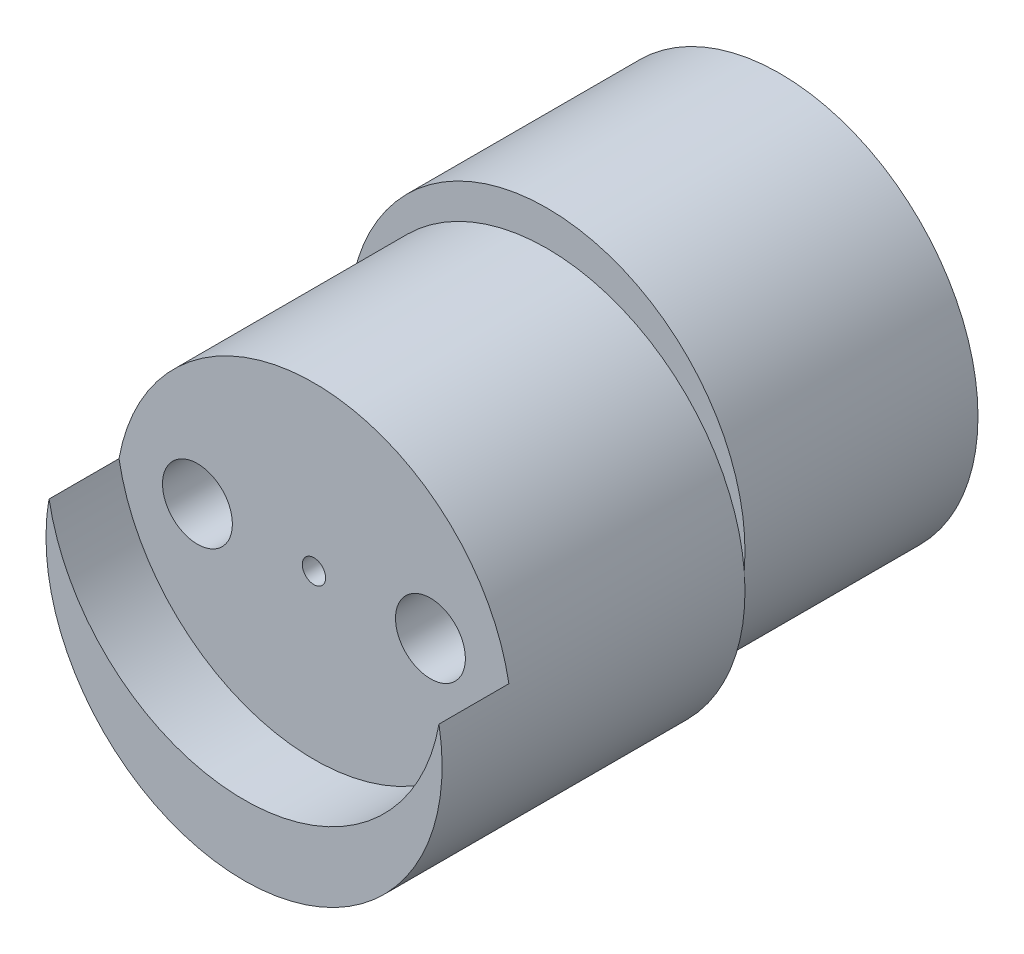
ISO-10303-21;
HEADER;
FILE_DESCRIPTION(('STEP AP214'),'2;1');
FILE_NAME('part.step','',(''),(''),'','','');
FILE_SCHEMA(('AUTOMOTIVE_DESIGN { 1 0 10303 214 1 1 1 1 }'));
ENDSEC;
DATA;
#1=APPLICATION_CONTEXT('core data for automotive mechanical design processes');
#2=APPLICATION_PROTOCOL_DEFINITION('international standard','automotive_design',2000,#1);
#3=PRODUCT_CONTEXT('',#1,'mechanical');
#4=PRODUCT('Part','Part','',(#3));
#5=PRODUCT_RELATED_PRODUCT_CATEGORY('part','',(#4));
#6=PRODUCT_DEFINITION_FORMATION('','',#4);
#7=PRODUCT_DEFINITION_CONTEXT('part definition',#1,'design');
#8=PRODUCT_DEFINITION('design','',#6,#7);
#9=PRODUCT_DEFINITION_SHAPE('','',#8);
#10=(LENGTH_UNIT() NAMED_UNIT(*) SI_UNIT(.MILLI.,.METRE.));
#11=(NAMED_UNIT(*) PLANE_ANGLE_UNIT() SI_UNIT($,.RADIAN.));
#12=(NAMED_UNIT(*) SI_UNIT($,.STERADIAN.) SOLID_ANGLE_UNIT());
#13=UNCERTAINTY_MEASURE_WITH_UNIT(LENGTH_MEASURE(1.E-05),#10,'distance_accuracy_value','');
#14=(GEOMETRIC_REPRESENTATION_CONTEXT(3) GLOBAL_UNCERTAINTY_ASSIGNED_CONTEXT((#13)) GLOBAL_UNIT_ASSIGNED_CONTEXT((#10,
#11,#12)) REPRESENTATION_CONTEXT('',''));
#15=CARTESIAN_POINT('',(0.,0.,0.));
#16=DIRECTION('',(0.,0.,1.));
#17=DIRECTION('',(1.,0.,0.));
#18=AXIS2_PLACEMENT_3D('',#15,#16,#17);
#19=CARTESIAN_POINT('',(0.,-1.5,20.));
#20=DIRECTION('',(0.,0.,1.));
#21=DIRECTION('',(1.,0.,0.));
#22=AXIS2_PLACEMENT_3D('',#19,#20,#21);
#23=PLANE('',#22);
#24=CARTESIAN_POINT('',(0.,0.,20.));
#25=DIRECTION('',(0.,0.,1.));
#26=DIRECTION('',(1.,0.,0.));
#27=AXIS2_PLACEMENT_3D('',#24,#25,#26);
#28=CIRCLE('',#27,0.5);
#29=CARTESIAN_POINT('',(0.5,0.,20.));
#30=VERTEX_POINT('',#29);
#31=EDGE_CURVE('E106',#30,#30,#28,.T.);
#32=ORIENTED_EDGE('',*,*,#31,.F.);
#33=EDGE_LOOP('',(#32));
#34=FACE_BOUND('',#33,.T.);
#35=CARTESIAN_POINT('',(-5.,0.,20.));
#36=DIRECTION('',(0.,0.,1.));
#37=DIRECTION('',(1.,0.,0.));
#38=AXIS2_PLACEMENT_3D('',#35,#36,#37);
#39=CIRCLE('',#38,1.5);
#40=CARTESIAN_POINT('',(-3.5,0.,20.));
#41=VERTEX_POINT('',#40);
#42=EDGE_CURVE('E104',#41,#41,#39,.T.);
#43=ORIENTED_EDGE('',*,*,#42,.F.);
#44=EDGE_LOOP('',(#43));
#45=FACE_BOUND('',#44,.T.);
#46=CARTESIAN_POINT('',(5.,0.,20.));
#47=DIRECTION('',(0.,0.,1.));
#48=DIRECTION('',(1.,0.,0.));
#49=AXIS2_PLACEMENT_3D('',#46,#47,#48);
#50=CIRCLE('',#49,1.5);
#51=CARTESIAN_POINT('',(6.5,0.,20.));
#52=VERTEX_POINT('',#51);
#53=EDGE_CURVE('E96',#52,#52,#50,.T.);
#54=ORIENTED_EDGE('',*,*,#53,.F.);
#55=EDGE_LOOP('',(#54));
#56=FACE_BOUND('',#55,.T.);
#57=CARTESIAN_POINT('',(0.,1.5,20.));
#58=DIRECTION('',(0.,0.,-1.));
#59=DIRECTION('',(1.,0.,0.));
#60=AXIS2_PLACEMENT_3D('',#57,#58,#59);
#61=CIRCLE('',#60,8.5);
#62=CARTESIAN_POINT('',(8.36660026534076,0.,20.));
#63=VERTEX_POINT('',#62);
#64=CARTESIAN_POINT('',(-8.36660026534076,0.,20.));
#65=VERTEX_POINT('',#64);
#66=EDGE_CURVE('E54',#63,#65,#61,.T.);
#67=ORIENTED_EDGE('',*,*,#66,.F.);
#68=CARTESIAN_POINT('',(0.,-1.5,20.));
#69=DIRECTION('',(0.,0.,1.));
#70=DIRECTION('',(1.,0.,0.));
#71=AXIS2_PLACEMENT_3D('',#68,#69,#70);
#72=CIRCLE('',#71,8.5);
#73=EDGE_CURVE('E92',#63,#65,#72,.T.);
#74=ORIENTED_EDGE('',*,*,#73,.T.);
#75=EDGE_LOOP('',(#67,#74));
#76=FACE_BOUND('',#75,.T.);
#77=ADVANCED_FACE('F39',(#34,#45,#56,#76),#23,.T.);
#78=CARTESIAN_POINT('',(0.,0.,10.));
#79=DIRECTION('',(0.,0.,-1.));
#80=DIRECTION('',(-1.,0.,0.));
#81=AXIS2_PLACEMENT_3D('',#78,#79,#80);
#82=CYLINDRICAL_SURFACE('',#81,8.5);
#83=CARTESIAN_POINT('',(0.,0.,10.));
#84=DIRECTION('',(0.,0.,1.));
#85=DIRECTION('',(1.,0.,0.));
#86=AXIS2_PLACEMENT_3D('',#83,#84,#85);
#87=CIRCLE('',#86,8.5);
#88=CARTESIAN_POINT('',(-8.46684711093805,-0.750000000000001,10.));
#89=VERTEX_POINT('',#88);
#90=CARTESIAN_POINT('',(8.46684711093805,-0.749999999999999,10.));
#91=VERTEX_POINT('',#90);
#92=EDGE_CURVE('E11',#89,#91,#87,.T.);
#93=ORIENTED_EDGE('',*,*,#92,.F.);
#94=EDGE_CURVE('E48',#91,#89,#87,.T.);
#95=ORIENTED_EDGE('',*,*,#94,.F.);
#96=EDGE_LOOP('',(#93,#95));
#97=FACE_BOUND('',#96,.T.);
#98=CARTESIAN_POINT('',(0.,0.,0.));
#99=DIRECTION('',(0.,0.,1.));
#100=DIRECTION('',(1.,0.,0.));
#101=AXIS2_PLACEMENT_3D('',#98,#99,#100);
#102=CIRCLE('',#101,8.5);
#103=CARTESIAN_POINT('',(8.5,0.,0.));
#104=VERTEX_POINT('',#103);
#105=EDGE_CURVE('E43',#104,#104,#102,.T.);
#106=ORIENTED_EDGE('',*,*,#105,.T.);
#107=EDGE_LOOP('',(#106));
#108=FACE_BOUND('',#107,.T.);
#109=ADVANCED_FACE('F41',(#97,#108),#82,.T.);
#110=CARTESIAN_POINT('',(0.,0.,10.));
#111=DIRECTION('',(0.,0.,1.));
#112=DIRECTION('',(1.,0.,0.));
#113=AXIS2_PLACEMENT_3D('',#110,#111,#112);
#114=PLANE('',#113);
#115=CARTESIAN_POINT('',(0.,-1.5,10.));
#116=DIRECTION('',(0.,0.,1.));
#117=DIRECTION('',(1.,0.,0.));
#118=AXIS2_PLACEMENT_3D('',#115,#116,#117);
#119=CIRCLE('',#118,8.5);
#120=EDGE_CURVE('E61',#91,#89,#119,.T.);
#121=ORIENTED_EDGE('',*,*,#120,.F.);
#122=ORIENTED_EDGE('',*,*,#94,.T.);
#123=EDGE_LOOP('',(#121,#122));
#124=FACE_BOUND('',#123,.T.);
#125=ADVANCED_FACE('F123',(#124),#114,.T.);
#126=CARTESIAN_POINT('',(0.,0.,0.));
#127=DIRECTION('',(0.,0.,1.));
#128=DIRECTION('',(1.,0.,0.));
#129=AXIS2_PLACEMENT_3D('',#126,#127,#128);
#130=PLANE('',#129);
#131=CARTESIAN_POINT('',(5.,0.,0.));
#132=DIRECTION('',(0.,0.,1.));
#133=DIRECTION('',(1.,0.,0.));
#134=AXIS2_PLACEMENT_3D('',#131,#132,#133);
#135=CIRCLE('',#134,1.5);
#136=CARTESIAN_POINT('',(6.5,0.,0.));
#137=VERTEX_POINT('',#136);
#138=EDGE_CURVE('E93',#137,#137,#135,.F.);
#139=ORIENTED_EDGE('',*,*,#138,.F.);
#140=EDGE_LOOP('',(#139));
#141=FACE_BOUND('',#140,.T.);
#142=CARTESIAN_POINT('',(-5.,0.,0.));
#143=DIRECTION('',(0.,0.,1.));
#144=DIRECTION('',(1.,0.,0.));
#145=AXIS2_PLACEMENT_3D('',#142,#143,#144);
#146=CIRCLE('',#145,1.5);
#147=CARTESIAN_POINT('',(-3.5,0.,0.));
#148=VERTEX_POINT('',#147);
#149=EDGE_CURVE('E101',#148,#148,#146,.F.);
#150=ORIENTED_EDGE('',*,*,#149,.F.);
#151=EDGE_LOOP('',(#150));
#152=FACE_BOUND('',#151,.T.);
#153=CARTESIAN_POINT('',(0.,0.,0.));
#154=DIRECTION('',(0.,0.,1.));
#155=DIRECTION('',(1.,0.,0.));
#156=AXIS2_PLACEMENT_3D('',#153,#154,#155);
#157=CIRCLE('',#156,0.5);
#158=CARTESIAN_POINT('',(0.5,0.,0.));
#159=VERTEX_POINT('',#158);
#160=EDGE_CURVE('E112',#159,#159,#157,.F.);
#161=ORIENTED_EDGE('',*,*,#160,.F.);
#162=EDGE_LOOP('',(#161));
#163=FACE_BOUND('',#162,.T.);
#164=ORIENTED_EDGE('',*,*,#105,.F.);
#165=EDGE_LOOP('',(#164));
#166=FACE_BOUND('',#165,.T.);
#167=ADVANCED_FACE('F127',(#141,#152,#163,#166),#130,.F.);
#168=CARTESIAN_POINT('',(0.,-1.5,10.));
#169=DIRECTION('',(0.,0.,1.));
#170=DIRECTION('',(1.,0.,0.));
#171=AXIS2_PLACEMENT_3D('',#168,#169,#170);
#172=PLANE('',#171);
#173=EDGE_CURVE('E115',#89,#91,#119,.T.);
#174=ORIENTED_EDGE('',*,*,#173,.F.);
#175=ORIENTED_EDGE('',*,*,#92,.T.);
#176=EDGE_LOOP('',(#174,#175));
#177=FACE_BOUND('',#176,.T.);
#178=ADVANCED_FACE('F120',(#177),#172,.F.);
#179=CARTESIAN_POINT('',(0.,-1.5,20.));
#180=DIRECTION('',(0.,0.,-1.));
#181=DIRECTION('',(-1.,0.,0.));
#182=AXIS2_PLACEMENT_3D('',#179,#180,#181);
#183=CYLINDRICAL_SURFACE('',#182,8.5);
#184=ORIENTED_EDGE('',*,*,#73,.F.);
#185=DIRECTION('',(0.,0.,-1.));
#186=VECTOR('',#185,1.);
#187=CARTESIAN_POINT('',(8.36660026534076,0.,23.));
#188=LINE('',#187,#186);
#189=CARTESIAN_POINT('',(8.36660026534076,0.,23.));
#190=VERTEX_POINT('',#189);
#191=EDGE_CURVE('E80',#190,#63,#188,.T.);
#192=ORIENTED_EDGE('',*,*,#191,.F.);
#193=CARTESIAN_POINT('',(0.,-1.5,23.));
#194=DIRECTION('',(0.,0.,1.));
#195=DIRECTION('',(1.,0.,0.));
#196=AXIS2_PLACEMENT_3D('',#193,#194,#195);
#197=CIRCLE('',#196,8.5);
#198=CARTESIAN_POINT('',(-8.36660026534076,0.,23.));
#199=VERTEX_POINT('',#198);
#200=EDGE_CURVE('E85',#199,#190,#197,.T.);
#201=ORIENTED_EDGE('',*,*,#200,.F.);
#202=DIRECTION('',(0.,0.,-1.));
#203=VECTOR('',#202,1.);
#204=CARTESIAN_POINT('',(-8.36660026534076,0.,23.));
#205=LINE('',#204,#203);
#206=EDGE_CURVE('E82',#199,#65,#205,.T.);
#207=ORIENTED_EDGE('',*,*,#206,.T.);
#208=EDGE_LOOP('',(#184,#192,#201,#207));
#209=FACE_BOUND('',#208,.T.);
#210=ORIENTED_EDGE('',*,*,#120,.T.);
#211=ORIENTED_EDGE('',*,*,#173,.T.);
#212=EDGE_LOOP('',(#210,#211));
#213=FACE_BOUND('',#212,.T.);
#214=ADVANCED_FACE('F90',(#209,#213),#183,.T.);
#215=CARTESIAN_POINT('',(0.,0.,-4.24264068711928));
#216=DIRECTION('',(0.,0.,1.));
#217=DIRECTION('',(1.,0.,0.));
#218=AXIS2_PLACEMENT_3D('',#215,#216,#217);
#219=CYLINDRICAL_SURFACE('',#218,0.5);
#220=ORIENTED_EDGE('',*,*,#160,.T.);
#221=EDGE_LOOP('',(#220));
#222=FACE_BOUND('',#221,.T.);
#223=ORIENTED_EDGE('',*,*,#31,.T.);
#224=EDGE_LOOP('',(#223));
#225=FACE_BOUND('',#224,.T.);
#226=ADVANCED_FACE('F150',(#222,#225),#219,.F.);
#227=CARTESIAN_POINT('',(-5.,0.,-4.24264068711928));
#228=DIRECTION('',(0.,0.,1.));
#229=DIRECTION('',(1.,0.,0.));
#230=AXIS2_PLACEMENT_3D('',#227,#228,#229);
#231=CYLINDRICAL_SURFACE('',#230,1.5);
#232=CARTESIAN_POINT('',(-3.5,0.,0.));
#233=CARTESIAN_POINT('',(-3.5,0.,0.208333333333333));
#234=CARTESIAN_POINT('',(-3.5,0.,0.416666666666666));
#235=CARTESIAN_POINT('',(-3.5,0.,0.833333333333333));
#236=CARTESIAN_POINT('',(-3.5,0.,1.04166666666667));
#237=CARTESIAN_POINT('',(-3.5,0.,1.45833333333333));
#238=CARTESIAN_POINT('',(-3.5,0.,1.66666666666667));
#239=CARTESIAN_POINT('',(-3.5,0.,2.08333333333333));
#240=CARTESIAN_POINT('',(-3.5,0.,2.29166666666667));
#241=CARTESIAN_POINT('',(-3.5,0.,2.70833333333333));
#242=CARTESIAN_POINT('',(-3.5,0.,2.91666666666667));
#243=CARTESIAN_POINT('',(-3.5,0.,3.33333333333333));
#244=CARTESIAN_POINT('',(-3.5,0.,3.54166666666667));
#245=CARTESIAN_POINT('',(-3.5,0.,3.95833333333333));
#246=CARTESIAN_POINT('',(-3.5,0.,4.16666666666667));
#247=CARTESIAN_POINT('',(-3.5,0.,4.58333333333333));
#248=CARTESIAN_POINT('',(-3.5,0.,4.79166666666667));
#249=CARTESIAN_POINT('',(-3.5,0.,5.20833333333333));
#250=CARTESIAN_POINT('',(-3.5,0.,5.41666666666667));
#251=CARTESIAN_POINT('',(-3.5,0.,5.83333333333333));
#252=CARTESIAN_POINT('',(-3.5,0.,6.04166666666667));
#253=CARTESIAN_POINT('',(-3.5,0.,6.45833333333333));
#254=CARTESIAN_POINT('',(-3.5,0.,6.66666666666667));
#255=CARTESIAN_POINT('',(-3.5,0.,7.08333333333333));
#256=CARTESIAN_POINT('',(-3.5,0.,7.29166666666667));
#257=CARTESIAN_POINT('',(-3.5,0.,7.70833333333333));
#258=CARTESIAN_POINT('',(-3.5,0.,7.91666666666667));
#259=CARTESIAN_POINT('',(-3.5,0.,8.33333333333333));
#260=CARTESIAN_POINT('',(-3.5,0.,8.54166666666667));
#261=CARTESIAN_POINT('',(-3.5,0.,8.95833333333333));
#262=CARTESIAN_POINT('',(-3.5,0.,9.16666666666667));
#263=CARTESIAN_POINT('',(-3.5,0.,9.58333333333333));
#264=CARTESIAN_POINT('',(-3.5,0.,9.79166666666667));
#265=CARTESIAN_POINT('',(-3.5,0.,10.2083333333333));
#266=CARTESIAN_POINT('',(-3.5,0.,10.4166666666667));
#267=CARTESIAN_POINT('',(-3.5,0.,10.8333333333333));
#268=CARTESIAN_POINT('',(-3.5,0.,11.0416666666667));
#269=CARTESIAN_POINT('',(-3.5,0.,11.4583333333333));
#270=CARTESIAN_POINT('',(-3.5,0.,11.6666666666667));
#271=CARTESIAN_POINT('',(-3.5,0.,12.0833333333333));
#272=CARTESIAN_POINT('',(-3.5,0.,12.2916666666667));
#273=CARTESIAN_POINT('',(-3.5,0.,12.7083333333333));
#274=CARTESIAN_POINT('',(-3.5,0.,12.9166666666667));
#275=CARTESIAN_POINT('',(-3.5,0.,13.3333333333333));
#276=CARTESIAN_POINT('',(-3.5,0.,13.5416666666667));
#277=CARTESIAN_POINT('',(-3.5,0.,13.9583333333333));
#278=CARTESIAN_POINT('',(-3.5,0.,14.1666666666667));
#279=CARTESIAN_POINT('',(-3.5,0.,14.5833333333333));
#280=CARTESIAN_POINT('',(-3.5,0.,14.7916666666667));
#281=CARTESIAN_POINT('',(-3.5,0.,15.2083333333333));
#282=CARTESIAN_POINT('',(-3.5,0.,15.4166666666667));
#283=CARTESIAN_POINT('',(-3.5,0.,15.8333333333333));
#284=CARTESIAN_POINT('',(-3.5,0.,16.0416666666667));
#285=CARTESIAN_POINT('',(-3.5,0.,16.4583333333333));
#286=CARTESIAN_POINT('',(-3.5,0.,16.6666666666667));
#287=CARTESIAN_POINT('',(-3.5,0.,17.0833333333333));
#288=CARTESIAN_POINT('',(-3.5,0.,17.2916666666667));
#289=CARTESIAN_POINT('',(-3.5,0.,17.7083333333333));
#290=CARTESIAN_POINT('',(-3.5,0.,17.9166666666667));
#291=CARTESIAN_POINT('',(-3.5,0.,18.3333333333333));
#292=CARTESIAN_POINT('',(-3.5,0.,18.5416666666667));
#293=CARTESIAN_POINT('',(-3.5,0.,18.9583333333333));
#294=CARTESIAN_POINT('',(-3.5,0.,19.1666666666667));
#295=CARTESIAN_POINT('',(-3.5,0.,19.5833333333333));
#296=CARTESIAN_POINT('',(-3.5,0.,19.7916666666667));
#297=CARTESIAN_POINT('',(-3.5,0.,20.));
#298=B_SPLINE_CURVE_WITH_KNOTS('',3,(#232,#233,#234,#235,#236,#237,#238,#239,#240,#241,#242,
#243,#244,#245,#246,#247,#248,#249,#250,#251,#252,#253,#254,#255,#256,#257,#258,#259,#260,#261,
#262,#263,#264,#265,#266,#267,#268,#269,#270,#271,#272,#273,#274,#275,#276,#277,#278,#279,#280,
#281,#282,#283,#284,#285,#286,#287,#288,#289,#290,#291,#292,#293,#294,#295,#296,#297),
.UNSPECIFIED.,.F.,.F.,(4,2,2,2,2,2,2,2,2,2,2,2,2,2,2,2,2,2,2,2,2,2,2,2,2,2,2,2,2,2,2,2,4),(0.,
0.625000000000001,1.25,1.875,2.5,3.125,3.75,4.375,5.,5.625,6.25,6.875,7.5,8.125,8.75,9.375,10.,
10.625,11.25,11.875,12.5,13.125,13.75,14.375,15.,15.625,16.25,16.875,17.5,18.125,18.75,19.375,
20.),.UNSPECIFIED.);
#299=EDGE_CURVE('BSEAM156',#148,#41,#298,.T.);
#300=ORIENTED_EDGE('',*,*,#149,.T.);
#301=ORIENTED_EDGE('',*,*,#42,.T.);
#302=ORIENTED_EDGE('',*,*,#299,.T.);
#303=ORIENTED_EDGE('',*,*,#299,.F.);
#304=EDGE_LOOP('',(#300,#302,#301,#303));
#305=FACE_BOUND('',#304,.T.);
#306=ADVANCED_FACE('F156',(#305),#231,.F.);
#307=CARTESIAN_POINT('',(5.,0.,-4.24264068711928));
#308=DIRECTION('',(0.,0.,1.));
#309=DIRECTION('',(1.,0.,0.));
#310=AXIS2_PLACEMENT_3D('',#307,#308,#309);
#311=CYLINDRICAL_SURFACE('',#310,1.5);
#312=CARTESIAN_POINT('',(6.5,0.,0.));
#313=CARTESIAN_POINT('',(6.5,0.,0.208333333333333));
#314=CARTESIAN_POINT('',(6.5,0.,0.416666666666666));
#315=CARTESIAN_POINT('',(6.5,0.,0.833333333333333));
#316=CARTESIAN_POINT('',(6.5,0.,1.04166666666667));
#317=CARTESIAN_POINT('',(6.5,0.,1.45833333333333));
#318=CARTESIAN_POINT('',(6.5,0.,1.66666666666667));
#319=CARTESIAN_POINT('',(6.5,0.,2.08333333333333));
#320=CARTESIAN_POINT('',(6.5,0.,2.29166666666667));
#321=CARTESIAN_POINT('',(6.5,0.,2.70833333333333));
#322=CARTESIAN_POINT('',(6.5,0.,2.91666666666667));
#323=CARTESIAN_POINT('',(6.5,0.,3.33333333333333));
#324=CARTESIAN_POINT('',(6.5,0.,3.54166666666667));
#325=CARTESIAN_POINT('',(6.5,0.,3.95833333333333));
#326=CARTESIAN_POINT('',(6.5,0.,4.16666666666667));
#327=CARTESIAN_POINT('',(6.5,0.,4.58333333333333));
#328=CARTESIAN_POINT('',(6.5,0.,4.79166666666667));
#329=CARTESIAN_POINT('',(6.5,0.,5.20833333333333));
#330=CARTESIAN_POINT('',(6.5,0.,5.41666666666667));
#331=CARTESIAN_POINT('',(6.5,0.,5.83333333333333));
#332=CARTESIAN_POINT('',(6.5,0.,6.04166666666667));
#333=CARTESIAN_POINT('',(6.5,0.,6.45833333333333));
#334=CARTESIAN_POINT('',(6.5,0.,6.66666666666667));
#335=CARTESIAN_POINT('',(6.5,0.,7.08333333333333));
#336=CARTESIAN_POINT('',(6.5,0.,7.29166666666667));
#337=CARTESIAN_POINT('',(6.5,0.,7.70833333333333));
#338=CARTESIAN_POINT('',(6.5,0.,7.91666666666667));
#339=CARTESIAN_POINT('',(6.5,0.,8.33333333333333));
#340=CARTESIAN_POINT('',(6.5,0.,8.54166666666667));
#341=CARTESIAN_POINT('',(6.5,0.,8.95833333333333));
#342=CARTESIAN_POINT('',(6.5,0.,9.16666666666667));
#343=CARTESIAN_POINT('',(6.5,0.,9.58333333333333));
#344=CARTESIAN_POINT('',(6.5,0.,9.79166666666667));
#345=CARTESIAN_POINT('',(6.5,0.,10.2083333333333));
#346=CARTESIAN_POINT('',(6.5,0.,10.4166666666667));
#347=CARTESIAN_POINT('',(6.5,0.,10.8333333333333));
#348=CARTESIAN_POINT('',(6.5,0.,11.0416666666667));
#349=CARTESIAN_POINT('',(6.5,0.,11.4583333333333));
#350=CARTESIAN_POINT('',(6.5,0.,11.6666666666667));
#351=CARTESIAN_POINT('',(6.5,0.,12.0833333333333));
#352=CARTESIAN_POINT('',(6.5,0.,12.2916666666667));
#353=CARTESIAN_POINT('',(6.5,0.,12.7083333333333));
#354=CARTESIAN_POINT('',(6.5,0.,12.9166666666667));
#355=CARTESIAN_POINT('',(6.5,0.,13.3333333333333));
#356=CARTESIAN_POINT('',(6.5,0.,13.5416666666667));
#357=CARTESIAN_POINT('',(6.5,0.,13.9583333333333));
#358=CARTESIAN_POINT('',(6.5,0.,14.1666666666667));
#359=CARTESIAN_POINT('',(6.5,0.,14.5833333333333));
#360=CARTESIAN_POINT('',(6.5,0.,14.7916666666667));
#361=CARTESIAN_POINT('',(6.5,0.,15.2083333333333));
#362=CARTESIAN_POINT('',(6.5,0.,15.4166666666667));
#363=CARTESIAN_POINT('',(6.5,0.,15.8333333333333));
#364=CARTESIAN_POINT('',(6.5,0.,16.0416666666667));
#365=CARTESIAN_POINT('',(6.5,0.,16.4583333333333));
#366=CARTESIAN_POINT('',(6.5,0.,16.6666666666667));
#367=CARTESIAN_POINT('',(6.5,0.,17.0833333333333));
#368=CARTESIAN_POINT('',(6.5,0.,17.2916666666667));
#369=CARTESIAN_POINT('',(6.5,0.,17.7083333333333));
#370=CARTESIAN_POINT('',(6.5,0.,17.9166666666667));
#371=CARTESIAN_POINT('',(6.5,0.,18.3333333333333));
#372=CARTESIAN_POINT('',(6.5,0.,18.5416666666667));
#373=CARTESIAN_POINT('',(6.5,0.,18.9583333333333));
#374=CARTESIAN_POINT('',(6.5,0.,19.1666666666667));
#375=CARTESIAN_POINT('',(6.5,0.,19.5833333333333));
#376=CARTESIAN_POINT('',(6.5,0.,19.7916666666667));
#377=CARTESIAN_POINT('',(6.5,0.,20.));
#378=B_SPLINE_CURVE_WITH_KNOTS('',3,(#312,#313,#314,#315,#316,#317,#318,#319,#320,#321,#322,
#323,#324,#325,#326,#327,#328,#329,#330,#331,#332,#333,#334,#335,#336,#337,#338,#339,#340,#341,
#342,#343,#344,#345,#346,#347,#348,#349,#350,#351,#352,#353,#354,#355,#356,#357,#358,#359,#360,
#361,#362,#363,#364,#365,#366,#367,#368,#369,#370,#371,#372,#373,#374,#375,#376,#377),
.UNSPECIFIED.,.F.,.F.,(4,2,2,2,2,2,2,2,2,2,2,2,2,2,2,2,2,2,2,2,2,2,2,2,2,2,2,2,2,2,2,2,4),(0.,
0.625000000000001,1.25,1.875,2.5,3.125,3.75,4.375,5.,5.625,6.25,6.875,7.5,8.125,8.75,9.375,10.,
10.625,11.25,11.875,12.5,13.125,13.75,14.375,15.,15.625,16.25,16.875,17.5,18.125,18.75,19.375,
20.),.UNSPECIFIED.);
#379=EDGE_CURVE('BSEAM161',#137,#52,#378,.T.);
#380=ORIENTED_EDGE('',*,*,#138,.T.);
#381=ORIENTED_EDGE('',*,*,#53,.T.);
#382=ORIENTED_EDGE('',*,*,#379,.T.);
#383=ORIENTED_EDGE('',*,*,#379,.F.);
#384=EDGE_LOOP('',(#380,#382,#381,#383));
#385=FACE_BOUND('',#384,.T.);
#386=ADVANCED_FACE('F161',(#385),#311,.F.);
#387=CARTESIAN_POINT('',(0.,1.5,23.));
#388=DIRECTION('',(0.,0.,-1.));
#389=DIRECTION('',(-1.,0.,0.));
#390=AXIS2_PLACEMENT_3D('',#387,#388,#389);
#391=CYLINDRICAL_SURFACE('',#390,8.5);
#392=ORIENTED_EDGE('',*,*,#66,.T.);
#393=ORIENTED_EDGE('',*,*,#206,.F.);
#394=CARTESIAN_POINT('',(0.,1.5,23.));
#395=DIRECTION('',(0.,0.,-1.));
#396=DIRECTION('',(1.,0.,0.));
#397=AXIS2_PLACEMENT_3D('',#394,#395,#396);
#398=CIRCLE('',#397,8.5);
#399=EDGE_CURVE('E76',#190,#199,#398,.T.);
#400=ORIENTED_EDGE('',*,*,#399,.F.);
#401=ORIENTED_EDGE('',*,*,#191,.T.);
#402=EDGE_LOOP('',(#392,#393,#400,#401));
#403=FACE_BOUND('',#402,.T.);
#404=ADVANCED_FACE('F78',(#403),#391,.F.);
#405=CARTESIAN_POINT('',(0.,0.,23.));
#406=DIRECTION('',(0.,0.,1.));
#407=DIRECTION('',(1.,0.,0.));
#408=AXIS2_PLACEMENT_3D('',#405,#406,#407);
#409=PLANE('',#408);
#410=ORIENTED_EDGE('',*,*,#200,.T.);
#411=ORIENTED_EDGE('',*,*,#399,.T.);
#412=EDGE_LOOP('',(#410,#411));
#413=FACE_BOUND('',#412,.T.);
#414=ADVANCED_FACE('F87',(#413),#409,.T.);
#415=CLOSED_SHELL('',(#77,#109,#125,#167,#178,#214,#226,#306,#386,#404,#414));
#416=MANIFOLD_SOLID_BREP('B2',#415);
#417=ADVANCED_BREP_SHAPE_REPRESENTATION('',(#18,#416),#14);
#418=SHAPE_DEFINITION_REPRESENTATION(#9,#417);
ENDSEC;
END-ISO-10303-21;
